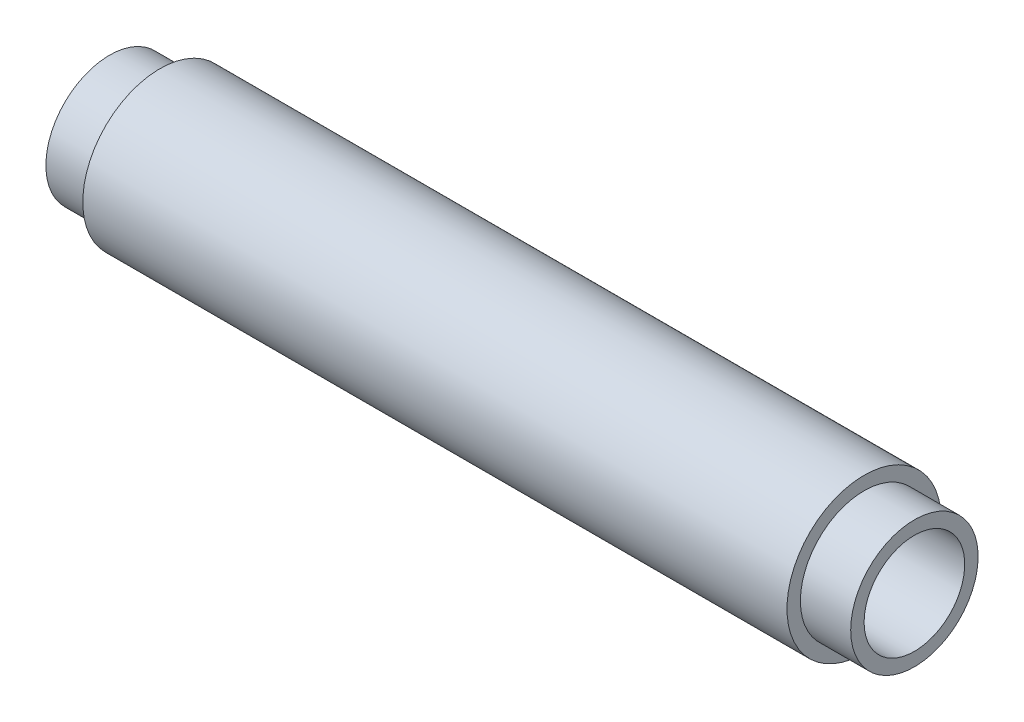
ISO-10303-21;
HEADER;
FILE_DESCRIPTION(('STEP AP214'),'2;1');
FILE_NAME('part.step','',(''),(''),'','','');
FILE_SCHEMA(('AUTOMOTIVE_DESIGN { 1 0 10303 214 1 1 1 1 }'));
ENDSEC;
DATA;
#1=APPLICATION_CONTEXT('core data for automotive mechanical design processes');
#2=APPLICATION_PROTOCOL_DEFINITION('international standard','automotive_design',2000,#1);
#3=PRODUCT_CONTEXT('',#1,'mechanical');
#4=PRODUCT('Part','Part','',(#3));
#5=PRODUCT_RELATED_PRODUCT_CATEGORY('part','',(#4));
#6=PRODUCT_DEFINITION_FORMATION('','',#4);
#7=PRODUCT_DEFINITION_CONTEXT('part definition',#1,'design');
#8=PRODUCT_DEFINITION('design','',#6,#7);
#9=PRODUCT_DEFINITION_SHAPE('','',#8);
#10=(LENGTH_UNIT() NAMED_UNIT(*) SI_UNIT(.MILLI.,.METRE.));
#11=(NAMED_UNIT(*) PLANE_ANGLE_UNIT() SI_UNIT($,.RADIAN.));
#12=(NAMED_UNIT(*) SI_UNIT($,.STERADIAN.) SOLID_ANGLE_UNIT());
#13=UNCERTAINTY_MEASURE_WITH_UNIT(LENGTH_MEASURE(1.E-05),#10,'distance_accuracy_value','');
#14=(GEOMETRIC_REPRESENTATION_CONTEXT(3) GLOBAL_UNCERTAINTY_ASSIGNED_CONTEXT((#13)) GLOBAL_UNIT_ASSIGNED_CONTEXT((#10,
#11,#12)) REPRESENTATION_CONTEXT('',''));
#15=CARTESIAN_POINT('',(0.,0.,0.));
#16=DIRECTION('',(0.,0.,1.));
#17=DIRECTION('',(1.,0.,0.));
#18=AXIS2_PLACEMENT_3D('',#15,#16,#17);
#19=CARTESIAN_POINT('',(-66.675,0.,0.));
#20=DIRECTION('',(1.,0.,0.));
#21=DIRECTION('',(0.,0.,-1.));
#22=AXIS2_PLACEMENT_3D('',#19,#20,#21);
#23=PLANE('',#22);
#24=CARTESIAN_POINT('',(-66.675,0.,0.));
#25=DIRECTION('',(1.,0.,0.));
#26=DIRECTION('',(0.,0.,-1.));
#27=AXIS2_PLACEMENT_3D('',#24,#25,#26);
#28=CIRCLE('',#27,14.605);
#29=CARTESIAN_POINT('',(-66.675,0.,-14.605));
#30=VERTEX_POINT('',#29);
#31=EDGE_CURVE('E58',#30,#30,#28,.T.);
#32=ORIENTED_EDGE('',*,*,#31,.F.);
#33=EDGE_LOOP('',(#32));
#34=FACE_BOUND('',#33,.T.);
#35=CARTESIAN_POINT('',(-66.675,0.,0.));
#36=DIRECTION('',(1.,0.,0.));
#37=DIRECTION('',(0.,0.,-1.));
#38=AXIS2_PLACEMENT_3D('',#35,#36,#37);
#39=CIRCLE('',#38,12.065);
#40=CARTESIAN_POINT('',(-66.675,0.,-12.065));
#41=VERTEX_POINT('',#40);
#42=EDGE_CURVE('E50',#41,#41,#39,.F.);
#43=ORIENTED_EDGE('',*,*,#42,.F.);
#44=EDGE_LOOP('',(#43));
#45=FACE_BOUND('',#44,.T.);
#46=ADVANCED_FACE('F43',(#34,#45),#23,.F.);
#47=CARTESIAN_POINT('',(66.675,0.,0.));
#48=DIRECTION('',(1.,0.,0.));
#49=DIRECTION('',(0.,0.,-1.));
#50=AXIS2_PLACEMENT_3D('',#47,#48,#49);
#51=PLANE('',#50);
#52=CARTESIAN_POINT('',(66.675,0.,0.));
#53=DIRECTION('',(1.,0.,0.));
#54=DIRECTION('',(0.,0.,-1.));
#55=AXIS2_PLACEMENT_3D('',#52,#53,#54);
#56=CIRCLE('',#55,12.065);
#57=CARTESIAN_POINT('',(66.675,0.,12.065));
#58=VERTEX_POINT('',#57);
#59=EDGE_CURVE('E11',#58,#58,#56,.T.);
#60=ORIENTED_EDGE('',*,*,#59,.F.);
#61=EDGE_LOOP('',(#60));
#62=FACE_BOUND('',#61,.T.);
#63=CARTESIAN_POINT('',(66.675,0.,0.));
#64=DIRECTION('',(1.,0.,0.));
#65=DIRECTION('',(0.,0.,-1.));
#66=AXIS2_PLACEMENT_3D('',#63,#64,#65);
#67=CIRCLE('',#66,14.605);
#68=CARTESIAN_POINT('',(66.675,0.,-14.605));
#69=VERTEX_POINT('',#68);
#70=EDGE_CURVE('E54',#69,#69,#67,.T.);
#71=ORIENTED_EDGE('',*,*,#70,.T.);
#72=EDGE_LOOP('',(#71));
#73=FACE_BOUND('',#72,.T.);
#74=ADVANCED_FACE('F84',(#62,#73),#51,.T.);
#75=CARTESIAN_POINT('',(-66.675,0.,0.));
#76=DIRECTION('',(1.,0.,0.));
#77=DIRECTION('',(0.,0.,-1.));
#78=AXIS2_PLACEMENT_3D('',#75,#76,#77);
#79=CYLINDRICAL_SURFACE('',#78,14.605);
#80=ORIENTED_EDGE('',*,*,#70,.F.);
#81=EDGE_LOOP('',(#80));
#82=FACE_BOUND('',#81,.T.);
#83=ORIENTED_EDGE('',*,*,#31,.T.);
#84=EDGE_LOOP('',(#83));
#85=FACE_BOUND('',#84,.T.);
#86=ADVANCED_FACE('F45',(#82,#85),#79,.T.);
#87=CARTESIAN_POINT('',(-66.675,0.,0.));
#88=DIRECTION('',(1.,0.,0.));
#89=DIRECTION('',(0.,0.,-1.));
#90=AXIS2_PLACEMENT_3D('',#87,#88,#89);
#91=CYLINDRICAL_SURFACE('',#90,9.525);
#92=CARTESIAN_POINT('',(-76.2,0.,0.));
#93=DIRECTION('',(-1.,0.,0.));
#94=DIRECTION('',(0.,0.,1.));
#95=AXIS2_PLACEMENT_3D('',#92,#93,#94);
#96=CIRCLE('',#95,9.525);
#97=CARTESIAN_POINT('',(-76.2,0.,9.525));
#98=VERTEX_POINT('',#97);
#99=EDGE_CURVE('E66',#98,#98,#96,.T.);
#100=ORIENTED_EDGE('',*,*,#99,.T.);
#101=EDGE_LOOP('',(#100));
#102=FACE_BOUND('',#101,.T.);
#103=CARTESIAN_POINT('',(76.2,0.,0.));
#104=DIRECTION('',(-1.,0.,0.));
#105=DIRECTION('',(0.,0.,1.));
#106=AXIS2_PLACEMENT_3D('',#103,#104,#105);
#107=CIRCLE('',#106,9.525);
#108=CARTESIAN_POINT('',(76.2,0.,9.525));
#109=VERTEX_POINT('',#108);
#110=EDGE_CURVE('E72',#109,#109,#107,.T.);
#111=ORIENTED_EDGE('',*,*,#110,.F.);
#112=EDGE_LOOP('',(#111));
#113=FACE_BOUND('',#112,.T.);
#114=ADVANCED_FACE('F79',(#102,#113),#91,.F.);
#115=CARTESIAN_POINT('',(-76.2,0.,0.));
#116=DIRECTION('',(-1.,0.,0.));
#117=DIRECTION('',(0.,0.,1.));
#118=AXIS2_PLACEMENT_3D('',#115,#116,#117);
#119=PLANE('',#118);
#120=CARTESIAN_POINT('',(-76.2,0.,0.));
#121=DIRECTION('',(-1.,0.,0.));
#122=DIRECTION('',(0.,0.,1.));
#123=AXIS2_PLACEMENT_3D('',#120,#121,#122);
#124=CIRCLE('',#123,12.065);
#125=CARTESIAN_POINT('',(-76.2,0.,-12.065));
#126=VERTEX_POINT('',#125);
#127=EDGE_CURVE('E62',#126,#126,#124,.T.);
#128=ORIENTED_EDGE('',*,*,#127,.T.);
#129=EDGE_LOOP('',(#128));
#130=FACE_BOUND('',#129,.T.);
#131=ORIENTED_EDGE('',*,*,#99,.F.);
#132=EDGE_LOOP('',(#131));
#133=FACE_BOUND('',#132,.T.);
#134=ADVANCED_FACE('F81',(#130,#133),#119,.T.);
#135=CARTESIAN_POINT('',(-76.2,0.,0.));
#136=DIRECTION('',(1.,0.,0.));
#137=DIRECTION('',(0.,0.,-1.));
#138=AXIS2_PLACEMENT_3D('',#135,#136,#137);
#139=CYLINDRICAL_SURFACE('',#138,12.065);
#140=CARTESIAN_POINT('',(-76.2,0.,-12.065));
#141=CARTESIAN_POINT('',(-76.10078125,0.,-12.065));
#142=CARTESIAN_POINT('',(-76.0015625,0.,-12.065));
#143=CARTESIAN_POINT('',(-75.803125,0.,-12.065));
#144=CARTESIAN_POINT('',(-75.70390625,0.,-12.065));
#145=CARTESIAN_POINT('',(-75.50546875,0.,-12.065));
#146=CARTESIAN_POINT('',(-75.40625,0.,-12.065));
#147=CARTESIAN_POINT('',(-75.2078125,0.,-12.065));
#148=CARTESIAN_POINT('',(-75.10859375,0.,-12.065));
#149=CARTESIAN_POINT('',(-74.91015625,0.,-12.065));
#150=CARTESIAN_POINT('',(-74.8109375,0.,-12.065));
#151=CARTESIAN_POINT('',(-74.6125,0.,-12.065));
#152=CARTESIAN_POINT('',(-74.51328125,0.,-12.065));
#153=CARTESIAN_POINT('',(-74.31484375,0.,-12.065));
#154=CARTESIAN_POINT('',(-74.215625,0.,-12.065));
#155=CARTESIAN_POINT('',(-74.0171875,0.,-12.065));
#156=CARTESIAN_POINT('',(-73.91796875,0.,-12.065));
#157=CARTESIAN_POINT('',(-73.71953125,0.,-12.065));
#158=CARTESIAN_POINT('',(-73.6203125,0.,-12.065));
#159=CARTESIAN_POINT('',(-73.421875,0.,-12.065));
#160=CARTESIAN_POINT('',(-73.32265625,0.,-12.065));
#161=CARTESIAN_POINT('',(-73.12421875,0.,-12.065));
#162=CARTESIAN_POINT('',(-73.025,0.,-12.065));
#163=CARTESIAN_POINT('',(-72.8265625,0.,-12.065));
#164=CARTESIAN_POINT('',(-72.72734375,0.,-12.065));
#165=CARTESIAN_POINT('',(-72.52890625,0.,-12.065));
#166=CARTESIAN_POINT('',(-72.4296875,0.,-12.065));
#167=CARTESIAN_POINT('',(-72.23125,0.,-12.065));
#168=CARTESIAN_POINT('',(-72.13203125,0.,-12.065));
#169=CARTESIAN_POINT('',(-71.93359375,0.,-12.065));
#170=CARTESIAN_POINT('',(-71.834375,0.,-12.065));
#171=CARTESIAN_POINT('',(-71.6359375,0.,-12.065));
#172=CARTESIAN_POINT('',(-71.53671875,0.,-12.065));
#173=CARTESIAN_POINT('',(-71.33828125,0.,-12.065));
#174=CARTESIAN_POINT('',(-71.2390625,0.,-12.065));
#175=CARTESIAN_POINT('',(-71.040625,0.,-12.065));
#176=CARTESIAN_POINT('',(-70.94140625,0.,-12.065));
#177=CARTESIAN_POINT('',(-70.74296875,0.,-12.065));
#178=CARTESIAN_POINT('',(-70.64375,0.,-12.065));
#179=CARTESIAN_POINT('',(-70.4453125,0.,-12.065));
#180=CARTESIAN_POINT('',(-70.34609375,0.,-12.065));
#181=CARTESIAN_POINT('',(-70.14765625,0.,-12.065));
#182=CARTESIAN_POINT('',(-70.0484375,0.,-12.065));
#183=CARTESIAN_POINT('',(-69.85,0.,-12.065));
#184=CARTESIAN_POINT('',(-69.75078125,0.,-12.065));
#185=CARTESIAN_POINT('',(-69.55234375,0.,-12.065));
#186=CARTESIAN_POINT('',(-69.453125,0.,-12.065));
#187=CARTESIAN_POINT('',(-69.2546875,0.,-12.065));
#188=CARTESIAN_POINT('',(-69.15546875,0.,-12.065));
#189=CARTESIAN_POINT('',(-68.95703125,0.,-12.065));
#190=CARTESIAN_POINT('',(-68.8578125,0.,-12.065));
#191=CARTESIAN_POINT('',(-68.659375,0.,-12.065));
#192=CARTESIAN_POINT('',(-68.56015625,0.,-12.065));
#193=CARTESIAN_POINT('',(-68.36171875,0.,-12.065));
#194=CARTESIAN_POINT('',(-68.2625,0.,-12.065));
#195=CARTESIAN_POINT('',(-68.0640625,0.,-12.065));
#196=CARTESIAN_POINT('',(-67.96484375,0.,-12.065));
#197=CARTESIAN_POINT('',(-67.76640625,0.,-12.065));
#198=CARTESIAN_POINT('',(-67.6671875,0.,-12.065));
#199=CARTESIAN_POINT('',(-67.46875,0.,-12.065));
#200=CARTESIAN_POINT('',(-67.36953125,0.,-12.065));
#201=CARTESIAN_POINT('',(-67.17109375,0.,-12.065));
#202=CARTESIAN_POINT('',(-67.071875,0.,-12.065));
#203=CARTESIAN_POINT('',(-66.8734375,0.,-12.065));
#204=CARTESIAN_POINT('',(-66.77421875,0.,-12.065));
#205=CARTESIAN_POINT('',(-66.675,0.,-12.065));
#206=B_SPLINE_CURVE_WITH_KNOTS('',3,(#140,#141,#142,#143,#144,#145,#146,#147,#148,#149,#150,
#151,#152,#153,#154,#155,#156,#157,#158,#159,#160,#161,#162,#163,#164,#165,#166,#167,#168,#169,
#170,#171,#172,#173,#174,#175,#176,#177,#178,#179,#180,#181,#182,#183,#184,#185,#186,#187,#188,
#189,#190,#191,#192,#193,#194,#195,#196,#197,#198,#199,#200,#201,#202,#203,#204,#205),
.UNSPECIFIED.,.F.,.F.,(4,2,2,2,2,2,2,2,2,2,2,2,2,2,2,2,2,2,2,2,2,2,2,2,2,2,2,2,2,2,2,2,4),(0.,
0.297656249999986,0.595312499999986,0.892968749999987,1.19062499999999,1.48828124999999,
1.78593749999999,2.08359374999999,2.38124999999999,2.67890624999999,2.97656249999999,
3.27421874999999,3.57187499999999,3.86953124999999,4.16718749999999,4.46484374999999,
4.76249999999999,5.06015624999999,5.35781249999999,5.65546874999999,5.95312499999999,
6.25078124999999,6.54843749999999,6.84609374999999,7.14374999999999,7.44140624999999,
7.73906249999999,8.03671874999999,8.33437499999999,8.63203124999999,8.92968749999999,
9.22734374999999,9.52499999999999),.UNSPECIFIED.);
#207=EDGE_CURVE('BSEAM90',#126,#41,#206,.T.);
#208=ORIENTED_EDGE('',*,*,#127,.F.);
#209=ORIENTED_EDGE('',*,*,#42,.T.);
#210=ORIENTED_EDGE('',*,*,#207,.T.);
#211=ORIENTED_EDGE('',*,*,#207,.F.);
#212=EDGE_LOOP('',(#208,#210,#209,#211));
#213=FACE_BOUND('',#212,.T.);
#214=ADVANCED_FACE('F90',(#213),#139,.T.);
#215=CARTESIAN_POINT('',(76.2,0.,0.));
#216=DIRECTION('',(-1.,0.,0.));
#217=DIRECTION('',(0.,0.,1.));
#218=AXIS2_PLACEMENT_3D('',#215,#216,#217);
#219=CYLINDRICAL_SURFACE('',#218,12.065);
#220=CARTESIAN_POINT('',(76.2,0.,0.));
#221=DIRECTION('',(-1.,0.,0.));
#222=DIRECTION('',(0.,0.,1.));
#223=AXIS2_PLACEMENT_3D('',#220,#221,#222);
#224=CIRCLE('',#223,12.065);
#225=CARTESIAN_POINT('',(76.2,0.,12.065));
#226=VERTEX_POINT('',#225);
#227=EDGE_CURVE('E69',#226,#226,#224,.T.);
#228=CARTESIAN_POINT('',(76.2,0.,12.065));
#229=CARTESIAN_POINT('',(76.10078125,0.,12.065));
#230=CARTESIAN_POINT('',(76.0015625,0.,12.065));
#231=CARTESIAN_POINT('',(75.803125,0.,12.065));
#232=CARTESIAN_POINT('',(75.70390625,0.,12.065));
#233=CARTESIAN_POINT('',(75.50546875,0.,12.065));
#234=CARTESIAN_POINT('',(75.40625,0.,12.065));
#235=CARTESIAN_POINT('',(75.2078125,0.,12.065));
#236=CARTESIAN_POINT('',(75.10859375,0.,12.065));
#237=CARTESIAN_POINT('',(74.91015625,0.,12.065));
#238=CARTESIAN_POINT('',(74.8109375,0.,12.065));
#239=CARTESIAN_POINT('',(74.6125,0.,12.065));
#240=CARTESIAN_POINT('',(74.51328125,0.,12.065));
#241=CARTESIAN_POINT('',(74.31484375,0.,12.065));
#242=CARTESIAN_POINT('',(74.215625,0.,12.065));
#243=CARTESIAN_POINT('',(74.0171875,0.,12.065));
#244=CARTESIAN_POINT('',(73.91796875,0.,12.065));
#245=CARTESIAN_POINT('',(73.71953125,0.,12.065));
#246=CARTESIAN_POINT('',(73.6203125,0.,12.065));
#247=CARTESIAN_POINT('',(73.421875,0.,12.065));
#248=CARTESIAN_POINT('',(73.32265625,0.,12.065));
#249=CARTESIAN_POINT('',(73.12421875,0.,12.065));
#250=CARTESIAN_POINT('',(73.025,0.,12.065));
#251=CARTESIAN_POINT('',(72.8265625,0.,12.065));
#252=CARTESIAN_POINT('',(72.72734375,0.,12.065));
#253=CARTESIAN_POINT('',(72.52890625,0.,12.065));
#254=CARTESIAN_POINT('',(72.4296875,0.,12.065));
#255=CARTESIAN_POINT('',(72.23125,0.,12.065));
#256=CARTESIAN_POINT('',(72.13203125,0.,12.065));
#257=CARTESIAN_POINT('',(71.93359375,0.,12.065));
#258=CARTESIAN_POINT('',(71.834375,0.,12.065));
#259=CARTESIAN_POINT('',(71.6359375,0.,12.065));
#260=CARTESIAN_POINT('',(71.53671875,0.,12.065));
#261=CARTESIAN_POINT('',(71.33828125,0.,12.065));
#262=CARTESIAN_POINT('',(71.2390625,0.,12.065));
#263=CARTESIAN_POINT('',(71.040625,0.,12.065));
#264=CARTESIAN_POINT('',(70.94140625,0.,12.065));
#265=CARTESIAN_POINT('',(70.74296875,0.,12.065));
#266=CARTESIAN_POINT('',(70.64375,0.,12.065));
#267=CARTESIAN_POINT('',(70.4453125,0.,12.065));
#268=CARTESIAN_POINT('',(70.34609375,0.,12.065));
#269=CARTESIAN_POINT('',(70.14765625,0.,12.065));
#270=CARTESIAN_POINT('',(70.0484375,0.,12.065));
#271=CARTESIAN_POINT('',(69.85,0.,12.065));
#272=CARTESIAN_POINT('',(69.75078125,0.,12.065));
#273=CARTESIAN_POINT('',(69.55234375,0.,12.065));
#274=CARTESIAN_POINT('',(69.453125,0.,12.065));
#275=CARTESIAN_POINT('',(69.2546875,0.,12.065));
#276=CARTESIAN_POINT('',(69.15546875,0.,12.065));
#277=CARTESIAN_POINT('',(68.95703125,0.,12.065));
#278=CARTESIAN_POINT('',(68.8578125,0.,12.065));
#279=CARTESIAN_POINT('',(68.659375,0.,12.065));
#280=CARTESIAN_POINT('',(68.56015625,0.,12.065));
#281=CARTESIAN_POINT('',(68.36171875,0.,12.065));
#282=CARTESIAN_POINT('',(68.2625,0.,12.065));
#283=CARTESIAN_POINT('',(68.0640625,0.,12.065));
#284=CARTESIAN_POINT('',(67.96484375,0.,12.065));
#285=CARTESIAN_POINT('',(67.76640625,0.,12.065));
#286=CARTESIAN_POINT('',(67.6671875,0.,12.065));
#287=CARTESIAN_POINT('',(67.46875,0.,12.065));
#288=CARTESIAN_POINT('',(67.36953125,0.,12.065));
#289=CARTESIAN_POINT('',(67.17109375,0.,12.065));
#290=CARTESIAN_POINT('',(67.071875,0.,12.065));
#291=CARTESIAN_POINT('',(66.8734375,0.,12.065));
#292=CARTESIAN_POINT('',(66.77421875,0.,12.065));
#293=CARTESIAN_POINT('',(66.675,0.,12.065));
#294=B_SPLINE_CURVE_WITH_KNOTS('',3,(#228,#229,#230,#231,#232,#233,#234,#235,#236,#237,#238,
#239,#240,#241,#242,#243,#244,#245,#246,#247,#248,#249,#250,#251,#252,#253,#254,#255,#256,#257,
#258,#259,#260,#261,#262,#263,#264,#265,#266,#267,#268,#269,#270,#271,#272,#273,#274,#275,#276,
#277,#278,#279,#280,#281,#282,#283,#284,#285,#286,#287,#288,#289,#290,#291,#292,#293),
.UNSPECIFIED.,.F.,.F.,(4,2,2,2,2,2,2,2,2,2,2,2,2,2,2,2,2,2,2,2,2,2,2,2,2,2,2,2,2,2,2,2,4),(0.,
0.29765625,0.5953125,0.892968750000001,1.190625,1.48828125,1.7859375,2.08359375,2.38125,
2.67890625,2.9765625,3.27421875,3.571875,3.86953125,4.1671875,4.46484375,4.7625,5.06015625,
5.3578125,5.65546875,5.953125,6.25078125,6.5484375,6.84609375,7.14375,7.44140625,7.7390625,
8.03671875000001,8.334375,8.63203125,8.92968750000001,9.22734375000001,9.52500000000001),.UNSPECIFIED.);
#295=EDGE_CURVE('BSEAM119',#226,#58,#294,.T.);
#296=ORIENTED_EDGE('',*,*,#227,.T.);
#297=ORIENTED_EDGE('',*,*,#59,.T.);
#298=ORIENTED_EDGE('',*,*,#295,.T.);
#299=ORIENTED_EDGE('',*,*,#295,.F.);
#300=EDGE_LOOP('',(#296,#298,#297,#299));
#301=FACE_BOUND('',#300,.T.);
#302=ADVANCED_FACE('F119',(#301),#219,.T.);
#303=CARTESIAN_POINT('',(76.2,0.,0.));
#304=DIRECTION('',(1.,0.,0.));
#305=DIRECTION('',(0.,0.,1.));
#306=AXIS2_PLACEMENT_3D('',#303,#304,#305);
#307=PLANE('',#306);
#308=ORIENTED_EDGE('',*,*,#110,.T.);
#309=EDGE_LOOP('',(#308));
#310=FACE_BOUND('',#309,.T.);
#311=ORIENTED_EDGE('',*,*,#227,.F.);
#312=EDGE_LOOP('',(#311));
#313=FACE_BOUND('',#312,.T.);
#314=ADVANCED_FACE('F76',(#310,#313),#307,.T.);
#315=CLOSED_SHELL('',(#46,#74,#86,#114,#134,#214,#302,#314));
#316=MANIFOLD_SOLID_BREP('B2',#315);
#317=ADVANCED_BREP_SHAPE_REPRESENTATION('',(#18,#316),#14);
#318=SHAPE_DEFINITION_REPRESENTATION(#9,#317);
ENDSEC;
END-ISO-10303-21;
